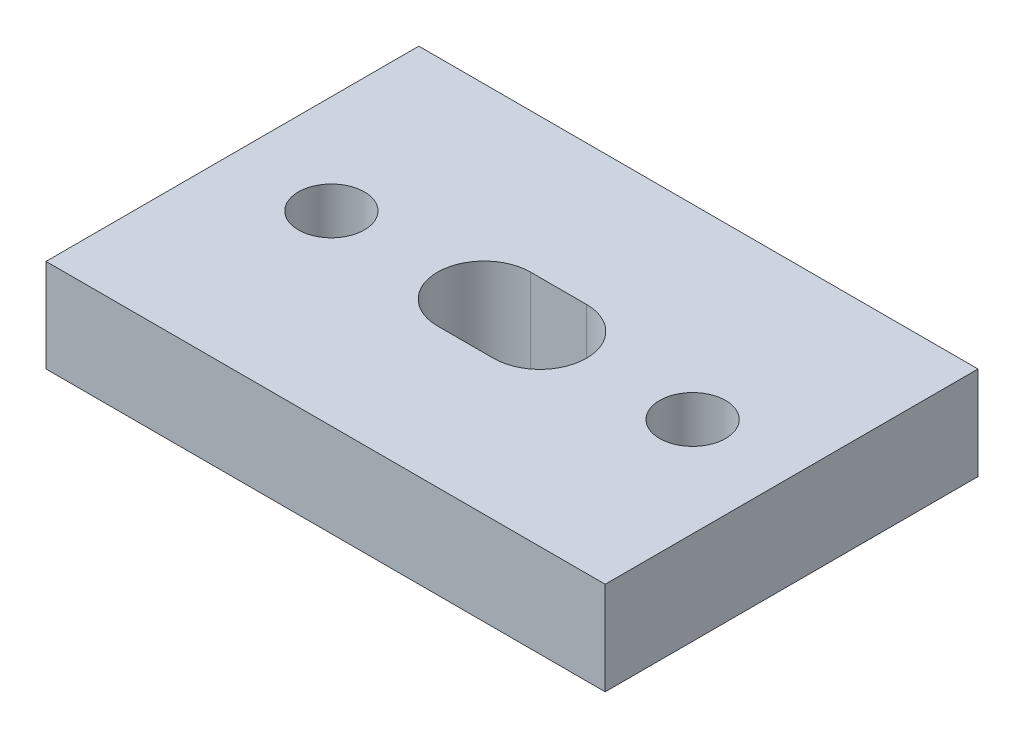
ISO-10303-21;
HEADER;
FILE_DESCRIPTION(('STEP AP214'),'2;1');
FILE_NAME('part.step','',(''),(''),'','','');
FILE_SCHEMA(('AUTOMOTIVE_DESIGN { 1 0 10303 214 1 1 1 1 }'));
ENDSEC;
DATA;
#1=APPLICATION_CONTEXT('core data for automotive mechanical design processes');
#2=APPLICATION_PROTOCOL_DEFINITION('international standard','automotive_design',2000,#1);
#3=PRODUCT_CONTEXT('',#1,'mechanical');
#4=PRODUCT('Part','Part','',(#3));
#5=PRODUCT_RELATED_PRODUCT_CATEGORY('part','',(#4));
#6=PRODUCT_DEFINITION_FORMATION('','',#4);
#7=PRODUCT_DEFINITION_CONTEXT('part definition',#1,'design');
#8=PRODUCT_DEFINITION('design','',#6,#7);
#9=PRODUCT_DEFINITION_SHAPE('','',#8);
#10=(LENGTH_UNIT() NAMED_UNIT(*) SI_UNIT(.MILLI.,.METRE.));
#11=(NAMED_UNIT(*) PLANE_ANGLE_UNIT() SI_UNIT($,.RADIAN.));
#12=(NAMED_UNIT(*) SI_UNIT($,.STERADIAN.) SOLID_ANGLE_UNIT());
#13=UNCERTAINTY_MEASURE_WITH_UNIT(LENGTH_MEASURE(1.E-05),#10,'distance_accuracy_value','');
#14=(GEOMETRIC_REPRESENTATION_CONTEXT(3) GLOBAL_UNCERTAINTY_ASSIGNED_CONTEXT((#13)) GLOBAL_UNIT_ASSIGNED_CONTEXT((#10,
#11,#12)) REPRESENTATION_CONTEXT('',''));
#15=CARTESIAN_POINT('',(0.,0.,0.));
#16=DIRECTION('',(0.,0.,1.));
#17=DIRECTION('',(1.,0.,0.));
#18=AXIS2_PLACEMENT_3D('',#15,#16,#17);
#19=CARTESIAN_POINT('',(0.,6.35,0.));
#20=DIRECTION('',(0.,1.,0.));
#21=DIRECTION('',(0.,0.,1.));
#22=AXIS2_PLACEMENT_3D('',#19,#20,#21);
#23=PLANE('',#22);
#24=CARTESIAN_POINT('',(-12.3063,6.35,0.));
#25=DIRECTION('',(0.,1.,0.));
#26=DIRECTION('',(0.,0.,1.));
#27=AXIS2_PLACEMENT_3D('',#24,#25,#26);
#28=CIRCLE('',#27,2.2479);
#29=CARTESIAN_POINT('',(-12.3063,6.35,2.2479));
#30=VERTEX_POINT('',#29);
#31=EDGE_CURVE('E158',#30,#30,#28,.T.);
#32=ORIENTED_EDGE('',*,*,#31,.F.);
#33=EDGE_LOOP('',(#32));
#34=FACE_BOUND('',#33,.T.);
#35=DIRECTION('',(0.,0.,-1.));
#36=VECTOR('',#35,1.);
#37=CARTESIAN_POINT('',(19.05,6.35,-12.7));
#38=LINE('',#37,#36);
#39=CARTESIAN_POINT('',(19.05,6.35,12.7));
#40=VERTEX_POINT('',#39);
#41=CARTESIAN_POINT('',(19.05,6.35,-12.7));
#42=VERTEX_POINT('',#41);
#43=EDGE_CURVE('E164',#40,#42,#38,.T.);
#44=ORIENTED_EDGE('',*,*,#43,.T.);
#45=DIRECTION('',(-1.,0.,0.));
#46=VECTOR('',#45,1.);
#47=CARTESIAN_POINT('',(-19.05,6.35,-12.7));
#48=LINE('',#47,#46);
#49=CARTESIAN_POINT('',(-19.05,6.35,-12.7));
#50=VERTEX_POINT('',#49);
#51=EDGE_CURVE('E168',#42,#50,#48,.T.);
#52=ORIENTED_EDGE('',*,*,#51,.T.);
#53=DIRECTION('',(0.,0.,1.));
#54=VECTOR('',#53,1.);
#55=CARTESIAN_POINT('',(-19.05,6.35,-12.7));
#56=LINE('',#55,#54);
#57=CARTESIAN_POINT('',(-19.05,6.35,12.7));
#58=VERTEX_POINT('',#57);
#59=EDGE_CURVE('E172',#50,#58,#56,.T.);
#60=ORIENTED_EDGE('',*,*,#59,.T.);
#61=DIRECTION('',(1.,0.,0.));
#62=VECTOR('',#61,1.);
#63=CARTESIAN_POINT('',(-19.05,6.35,12.7));
#64=LINE('',#63,#62);
#65=EDGE_CURVE('E174',#58,#40,#64,.T.);
#66=ORIENTED_EDGE('',*,*,#65,.T.);
#67=EDGE_LOOP('',(#44,#52,#60,#66));
#68=FACE_BOUND('',#67,.T.);
#69=CARTESIAN_POINT('',(12.3063,6.35,0.));
#70=DIRECTION('',(0.,1.,0.));
#71=DIRECTION('',(0.,0.,1.));
#72=AXIS2_PLACEMENT_3D('',#69,#70,#71);
#73=CIRCLE('',#72,2.2479);
#74=CARTESIAN_POINT('',(12.3063,6.35,2.2479));
#75=VERTEX_POINT('',#74);
#76=EDGE_CURVE('E150',#75,#75,#73,.T.);
#77=ORIENTED_EDGE('',*,*,#76,.F.);
#78=EDGE_LOOP('',(#77));
#79=FACE_BOUND('',#78,.T.);
#80=DIRECTION('',(1.,0.,0.));
#81=VECTOR('',#80,1.);
#82=CARTESIAN_POINT('',(-1.905,6.35,3.175));
#83=LINE('',#82,#81);
#84=CARTESIAN_POINT('',(-1.905,6.35,3.175));
#85=VERTEX_POINT('',#84);
#86=CARTESIAN_POINT('',(1.905,6.35,3.175));
#87=VERTEX_POINT('',#86);
#88=EDGE_CURVE('E118',#85,#87,#83,.T.);
#89=ORIENTED_EDGE('',*,*,#88,.F.);
#90=CARTESIAN_POINT('',(-1.905,6.35,0.));
#91=DIRECTION('',(0.,1.,0.));
#92=DIRECTION('',(0.,0.,1.));
#93=AXIS2_PLACEMENT_3D('',#90,#91,#92);
#94=CIRCLE('',#93,3.175);
#95=CARTESIAN_POINT('',(-1.905,6.35,-3.175));
#96=VERTEX_POINT('',#95);
#97=EDGE_CURVE('E110',#96,#85,#94,.T.);
#98=ORIENTED_EDGE('',*,*,#97,.F.);
#99=DIRECTION('',(-1.,0.,0.));
#100=VECTOR('',#99,1.);
#101=CARTESIAN_POINT('',(-1.905,6.35,-3.175));
#102=LINE('',#101,#100);
#103=CARTESIAN_POINT('',(1.905,6.35,-3.175));
#104=VERTEX_POINT('',#103);
#105=EDGE_CURVE('E133',#104,#96,#102,.T.);
#106=ORIENTED_EDGE('',*,*,#105,.F.);
#107=CARTESIAN_POINT('',(1.905,6.35,0.));
#108=DIRECTION('',(0.,1.,0.));
#109=DIRECTION('',(0.,0.,1.));
#110=AXIS2_PLACEMENT_3D('',#107,#108,#109);
#111=CIRCLE('',#110,3.175);
#112=EDGE_CURVE('E130',#87,#104,#111,.T.);
#113=ORIENTED_EDGE('',*,*,#112,.F.);
#114=EDGE_LOOP('',(#89,#98,#106,#113));
#115=FACE_BOUND('',#114,.T.);
#116=ADVANCED_FACE('F43',(#34,#68,#79,#115),#23,.T.);
#117=CARTESIAN_POINT('',(0.,0.,0.));
#118=DIRECTION('',(0.,1.,0.));
#119=DIRECTION('',(0.,0.,1.));
#120=AXIS2_PLACEMENT_3D('',#117,#118,#119);
#121=PLANE('',#120);
#122=CARTESIAN_POINT('',(12.3063,0.,0.));
#123=DIRECTION('',(0.,1.,0.));
#124=DIRECTION('',(0.,0.,1.));
#125=AXIS2_PLACEMENT_3D('',#122,#123,#124);
#126=CIRCLE('',#125,2.2479);
#127=CARTESIAN_POINT('',(12.3063,0.,2.2479));
#128=VERTEX_POINT('',#127);
#129=EDGE_CURVE('E126',#128,#128,#126,.T.);
#130=ORIENTED_EDGE('',*,*,#129,.T.);
#131=EDGE_LOOP('',(#130));
#132=FACE_BOUND('',#131,.T.);
#133=CARTESIAN_POINT('',(-12.3063,0.,0.));
#134=DIRECTION('',(0.,1.,0.));
#135=DIRECTION('',(0.,0.,1.));
#136=AXIS2_PLACEMENT_3D('',#133,#134,#135);
#137=CIRCLE('',#136,2.2479);
#138=CARTESIAN_POINT('',(-12.3063,0.,2.2479));
#139=VERTEX_POINT('',#138);
#140=EDGE_CURVE('E154',#139,#139,#137,.T.);
#141=ORIENTED_EDGE('',*,*,#140,.T.);
#142=EDGE_LOOP('',(#141));
#143=FACE_BOUND('',#142,.T.);
#144=DIRECTION('',(0.,0.,-1.));
#145=VECTOR('',#144,1.);
#146=CARTESIAN_POINT('',(19.05,0.,-12.7));
#147=LINE('',#146,#145);
#148=CARTESIAN_POINT('',(19.05,0.,12.7));
#149=VERTEX_POINT('',#148);
#150=CARTESIAN_POINT('',(19.05,0.,-12.7));
#151=VERTEX_POINT('',#150);
#152=EDGE_CURVE('E161',#149,#151,#147,.T.);
#153=ORIENTED_EDGE('',*,*,#152,.F.);
#154=DIRECTION('',(1.,0.,0.));
#155=VECTOR('',#154,1.);
#156=CARTESIAN_POINT('',(-19.05,0.,12.7));
#157=LINE('',#156,#155);
#158=CARTESIAN_POINT('',(-19.05,0.,12.7));
#159=VERTEX_POINT('',#158);
#160=EDGE_CURVE('E169',#159,#149,#157,.T.);
#161=ORIENTED_EDGE('',*,*,#160,.F.);
#162=DIRECTION('',(0.,0.,1.));
#163=VECTOR('',#162,1.);
#164=CARTESIAN_POINT('',(-19.05,0.,-12.7));
#165=LINE('',#164,#163);
#166=CARTESIAN_POINT('',(-19.05,0.,-12.7));
#167=VERTEX_POINT('',#166);
#168=EDGE_CURVE('E184',#167,#159,#165,.T.);
#169=ORIENTED_EDGE('',*,*,#168,.F.);
#170=DIRECTION('',(-1.,0.,0.));
#171=VECTOR('',#170,1.);
#172=CARTESIAN_POINT('',(-19.05,0.,-12.7));
#173=LINE('',#172,#171);
#174=EDGE_CURVE('E181',#151,#167,#173,.T.);
#175=ORIENTED_EDGE('',*,*,#174,.F.);
#176=EDGE_LOOP('',(#153,#161,#169,#175));
#177=FACE_BOUND('',#176,.T.);
#178=CARTESIAN_POINT('',(-1.905,0.,0.));
#179=DIRECTION('',(0.,1.,0.));
#180=DIRECTION('',(0.,0.,1.));
#181=AXIS2_PLACEMENT_3D('',#178,#179,#180);
#182=CIRCLE('',#181,3.175);
#183=CARTESIAN_POINT('',(-1.905,0.,-3.175));
#184=VERTEX_POINT('',#183);
#185=CARTESIAN_POINT('',(-1.905,0.,3.175));
#186=VERTEX_POINT('',#185);
#187=EDGE_CURVE('E66',#184,#186,#182,.T.);
#188=ORIENTED_EDGE('',*,*,#187,.T.);
#189=DIRECTION('',(1.,0.,0.));
#190=VECTOR('',#189,1.);
#191=CARTESIAN_POINT('',(-1.905,0.,3.175));
#192=LINE('',#191,#190);
#193=CARTESIAN_POINT('',(1.905,0.,3.175));
#194=VERTEX_POINT('',#193);
#195=EDGE_CURVE('E125',#186,#194,#192,.T.);
#196=ORIENTED_EDGE('',*,*,#195,.T.);
#197=CARTESIAN_POINT('',(1.905,0.,0.));
#198=DIRECTION('',(0.,1.,0.));
#199=DIRECTION('',(0.,0.,1.));
#200=AXIS2_PLACEMENT_3D('',#197,#198,#199);
#201=CIRCLE('',#200,3.175);
#202=CARTESIAN_POINT('',(1.905,0.,-3.175));
#203=VERTEX_POINT('',#202);
#204=EDGE_CURVE('E139',#194,#203,#201,.T.);
#205=ORIENTED_EDGE('',*,*,#204,.T.);
#206=DIRECTION('',(-1.,0.,0.));
#207=VECTOR('',#206,1.);
#208=CARTESIAN_POINT('',(-1.905,0.,-3.175));
#209=LINE('',#208,#207);
#210=EDGE_CURVE('E119',#203,#184,#209,.T.);
#211=ORIENTED_EDGE('',*,*,#210,.T.);
#212=EDGE_LOOP('',(#188,#196,#205,#211));
#213=FACE_BOUND('',#212,.T.);
#214=ADVANCED_FACE('F204',(#132,#143,#177,#213),#121,.F.);
#215=CARTESIAN_POINT('',(19.05,6.35,-12.7));
#216=DIRECTION('',(-1.,0.,0.));
#217=DIRECTION('',(0.,0.,1.));
#218=AXIS2_PLACEMENT_3D('',#215,#216,#217);
#219=PLANE('',#218);
#220=ORIENTED_EDGE('',*,*,#152,.T.);
#221=DIRECTION('',(0.,-1.,0.));
#222=VECTOR('',#221,1.);
#223=CARTESIAN_POINT('',(19.05,6.35,-12.7));
#224=LINE('',#223,#222);
#225=EDGE_CURVE('E11',#42,#151,#224,.T.);
#226=ORIENTED_EDGE('',*,*,#225,.F.);
#227=ORIENTED_EDGE('',*,*,#43,.F.);
#228=DIRECTION('',(0.,-1.,0.));
#229=VECTOR('',#228,1.);
#230=CARTESIAN_POINT('',(19.05,6.35,12.7));
#231=LINE('',#230,#229);
#232=EDGE_CURVE('E177',#40,#149,#231,.T.);
#233=ORIENTED_EDGE('',*,*,#232,.T.);
#234=EDGE_LOOP('',(#220,#226,#227,#233));
#235=FACE_BOUND('',#234,.T.);
#236=ADVANCED_FACE('F45',(#235),#219,.F.);
#237=CARTESIAN_POINT('',(-19.05,6.35,-12.7));
#238=DIRECTION('',(0.,0.,1.));
#239=DIRECTION('',(1.,0.,0.));
#240=AXIS2_PLACEMENT_3D('',#237,#238,#239);
#241=PLANE('',#240);
#242=ORIENTED_EDGE('',*,*,#174,.T.);
#243=DIRECTION('',(0.,-1.,0.));
#244=VECTOR('',#243,1.);
#245=CARTESIAN_POINT('',(-19.05,6.35,-12.7));
#246=LINE('',#245,#244);
#247=EDGE_CURVE('E51',#50,#167,#246,.T.);
#248=ORIENTED_EDGE('',*,*,#247,.F.);
#249=ORIENTED_EDGE('',*,*,#51,.F.);
#250=ORIENTED_EDGE('',*,*,#225,.T.);
#251=EDGE_LOOP('',(#242,#248,#249,#250));
#252=FACE_BOUND('',#251,.T.);
#253=ADVANCED_FACE('F215',(#252),#241,.F.);
#254=CARTESIAN_POINT('',(-19.05,6.35,-12.7));
#255=DIRECTION('',(1.,0.,0.));
#256=DIRECTION('',(0.,0.,-1.));
#257=AXIS2_PLACEMENT_3D('',#254,#255,#256);
#258=PLANE('',#257);
#259=ORIENTED_EDGE('',*,*,#168,.T.);
#260=DIRECTION('',(0.,-1.,0.));
#261=VECTOR('',#260,1.);
#262=CARTESIAN_POINT('',(-19.05,6.35,12.7));
#263=LINE('',#262,#261);
#264=EDGE_CURVE('E191',#58,#159,#263,.T.);
#265=ORIENTED_EDGE('',*,*,#264,.F.);
#266=ORIENTED_EDGE('',*,*,#59,.F.);
#267=ORIENTED_EDGE('',*,*,#247,.T.);
#268=EDGE_LOOP('',(#259,#265,#266,#267));
#269=FACE_BOUND('',#268,.T.);
#270=ADVANCED_FACE('F198',(#269),#258,.F.);
#271=CARTESIAN_POINT('',(-19.05,6.35,12.7));
#272=DIRECTION('',(0.,0.,-1.));
#273=DIRECTION('',(-1.,0.,0.));
#274=AXIS2_PLACEMENT_3D('',#271,#272,#273);
#275=PLANE('',#274);
#276=ORIENTED_EDGE('',*,*,#160,.T.);
#277=ORIENTED_EDGE('',*,*,#232,.F.);
#278=ORIENTED_EDGE('',*,*,#65,.F.);
#279=ORIENTED_EDGE('',*,*,#264,.T.);
#280=EDGE_LOOP('',(#276,#277,#278,#279));
#281=FACE_BOUND('',#280,.T.);
#282=ADVANCED_FACE('F208',(#281),#275,.F.);
#283=CARTESIAN_POINT('',(-12.3063,6.35,0.));
#284=DIRECTION('',(0.,-1.,0.));
#285=DIRECTION('',(0.,0.,-1.));
#286=AXIS2_PLACEMENT_3D('',#283,#284,#285);
#287=CYLINDRICAL_SURFACE('',#286,2.2479);
#288=ORIENTED_EDGE('',*,*,#31,.T.);
#289=EDGE_LOOP('',(#288));
#290=FACE_BOUND('',#289,.T.);
#291=ORIENTED_EDGE('',*,*,#140,.F.);
#292=EDGE_LOOP('',(#291));
#293=FACE_BOUND('',#292,.T.);
#294=ADVANCED_FACE('F232',(#290,#293),#287,.F.);
#295=CARTESIAN_POINT('',(12.3063,6.35,0.));
#296=DIRECTION('',(0.,-1.,0.));
#297=DIRECTION('',(0.,0.,-1.));
#298=AXIS2_PLACEMENT_3D('',#295,#296,#297);
#299=CYLINDRICAL_SURFACE('',#298,2.2479);
#300=ORIENTED_EDGE('',*,*,#76,.T.);
#301=EDGE_LOOP('',(#300));
#302=FACE_BOUND('',#301,.T.);
#303=ORIENTED_EDGE('',*,*,#129,.F.);
#304=EDGE_LOOP('',(#303));
#305=FACE_BOUND('',#304,.T.);
#306=ADVANCED_FACE('F239',(#302,#305),#299,.F.);
#307=CARTESIAN_POINT('',(-1.905,6.35,0.));
#308=DIRECTION('',(0.,-1.,0.));
#309=DIRECTION('',(0.,0.,-1.));
#310=AXIS2_PLACEMENT_3D('',#307,#308,#309);
#311=CYLINDRICAL_SURFACE('',#310,3.175);
#312=ORIENTED_EDGE('',*,*,#187,.F.);
#313=DIRECTION('',(0.,-1.,0.));
#314=VECTOR('',#313,1.);
#315=CARTESIAN_POINT('',(-1.905,6.35,-3.175));
#316=LINE('',#315,#314);
#317=EDGE_CURVE('E114',#96,#184,#316,.T.);
#318=ORIENTED_EDGE('',*,*,#317,.F.);
#319=ORIENTED_EDGE('',*,*,#97,.T.);
#320=DIRECTION('',(0.,-1.,0.));
#321=VECTOR('',#320,1.);
#322=CARTESIAN_POINT('',(-1.905,6.35,3.175));
#323=LINE('',#322,#321);
#324=EDGE_CURVE('E113',#85,#186,#323,.T.);
#325=ORIENTED_EDGE('',*,*,#324,.T.);
#326=EDGE_LOOP('',(#312,#318,#319,#325));
#327=FACE_BOUND('',#326,.T.);
#328=ADVANCED_FACE('F112',(#327),#311,.F.);
#329=CARTESIAN_POINT('',(-1.905,6.35,3.175));
#330=DIRECTION('',(0.,0.,-1.));
#331=DIRECTION('',(-1.,0.,0.));
#332=AXIS2_PLACEMENT_3D('',#329,#330,#331);
#333=PLANE('',#332);
#334=ORIENTED_EDGE('',*,*,#195,.F.);
#335=ORIENTED_EDGE('',*,*,#324,.F.);
#336=ORIENTED_EDGE('',*,*,#88,.T.);
#337=DIRECTION('',(0.,-1.,0.));
#338=VECTOR('',#337,1.);
#339=CARTESIAN_POINT('',(1.905,6.35,3.175));
#340=LINE('',#339,#338);
#341=EDGE_CURVE('E127',#87,#194,#340,.T.);
#342=ORIENTED_EDGE('',*,*,#341,.T.);
#343=EDGE_LOOP('',(#334,#335,#336,#342));
#344=FACE_BOUND('',#343,.T.);
#345=ADVANCED_FACE('F122',(#344),#333,.T.);
#346=CARTESIAN_POINT('',(1.905,6.35,0.));
#347=DIRECTION('',(0.,-1.,0.));
#348=DIRECTION('',(0.,0.,-1.));
#349=AXIS2_PLACEMENT_3D('',#346,#347,#348);
#350=CYLINDRICAL_SURFACE('',#349,3.175);
#351=ORIENTED_EDGE('',*,*,#204,.F.);
#352=ORIENTED_EDGE('',*,*,#341,.F.);
#353=ORIENTED_EDGE('',*,*,#112,.T.);
#354=DIRECTION('',(0.,-1.,0.));
#355=VECTOR('',#354,1.);
#356=CARTESIAN_POINT('',(1.905,6.35,-3.175));
#357=LINE('',#356,#355);
#358=EDGE_CURVE('E58',#104,#203,#357,.T.);
#359=ORIENTED_EDGE('',*,*,#358,.T.);
#360=EDGE_LOOP('',(#351,#352,#353,#359));
#361=FACE_BOUND('',#360,.T.);
#362=ADVANCED_FACE('F256',(#361),#350,.F.);
#363=CARTESIAN_POINT('',(-1.905,6.35,-3.175));
#364=DIRECTION('',(0.,0.,1.));
#365=DIRECTION('',(1.,0.,0.));
#366=AXIS2_PLACEMENT_3D('',#363,#364,#365);
#367=PLANE('',#366);
#368=ORIENTED_EDGE('',*,*,#210,.F.);
#369=ORIENTED_EDGE('',*,*,#358,.F.);
#370=ORIENTED_EDGE('',*,*,#105,.T.);
#371=ORIENTED_EDGE('',*,*,#317,.T.);
#372=EDGE_LOOP('',(#368,#369,#370,#371));
#373=FACE_BOUND('',#372,.T.);
#374=ADVANCED_FACE('F259',(#373),#367,.T.);
#375=CLOSED_SHELL('',(#116,#214,#236,#253,#270,#282,#294,#306,#328,#345,#362,#374));
#376=MANIFOLD_SOLID_BREP('B2',#375);
#377=ADVANCED_BREP_SHAPE_REPRESENTATION('',(#18,#376),#14);
#378=SHAPE_DEFINITION_REPRESENTATION(#9,#377);
ENDSEC;
END-ISO-10303-21;
